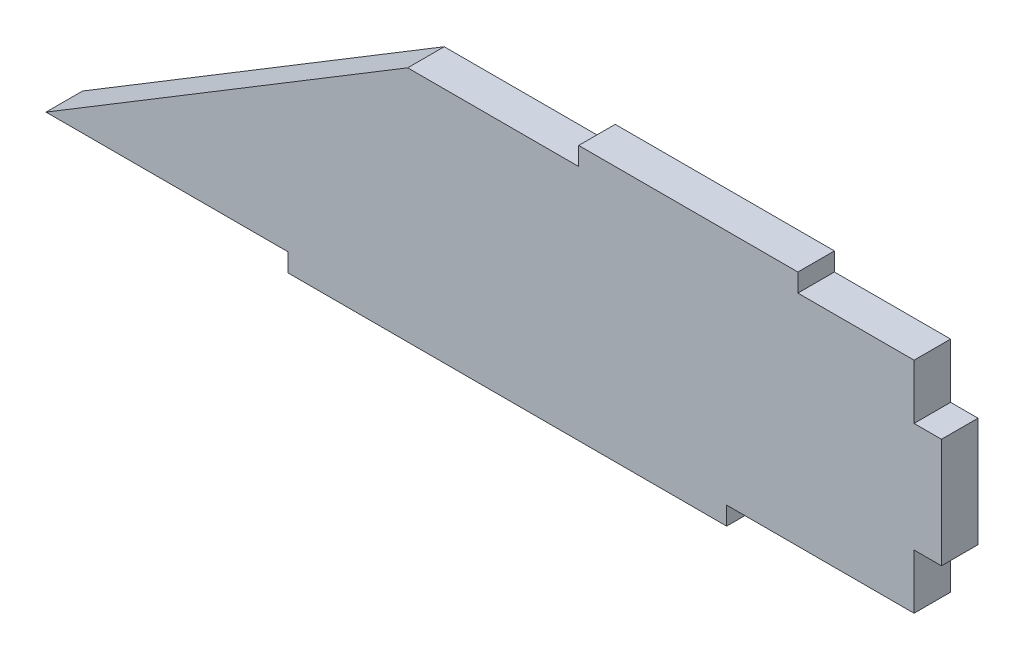
ISO-10303-21;
HEADER;
FILE_DESCRIPTION(('STEP AP214'),'2;1');
FILE_NAME('part.step','',(''),(''),'','','');
FILE_SCHEMA(('AUTOMOTIVE_DESIGN { 1 0 10303 214 1 1 1 1 }'));
ENDSEC;
DATA;
#1=APPLICATION_CONTEXT('core data for automotive mechanical design processes');
#2=APPLICATION_PROTOCOL_DEFINITION('international standard','automotive_design',2000,#1);
#3=PRODUCT_CONTEXT('',#1,'mechanical');
#4=PRODUCT('Part','Part','',(#3));
#5=PRODUCT_RELATED_PRODUCT_CATEGORY('part','',(#4));
#6=PRODUCT_DEFINITION_FORMATION('','',#4);
#7=PRODUCT_DEFINITION_CONTEXT('part definition',#1,'design');
#8=PRODUCT_DEFINITION('design','',#6,#7);
#9=PRODUCT_DEFINITION_SHAPE('','',#8);
#10=(LENGTH_UNIT() NAMED_UNIT(*) SI_UNIT(.MILLI.,.METRE.));
#11=(NAMED_UNIT(*) PLANE_ANGLE_UNIT() SI_UNIT($,.RADIAN.));
#12=(NAMED_UNIT(*) SI_UNIT($,.STERADIAN.) SOLID_ANGLE_UNIT());
#13=UNCERTAINTY_MEASURE_WITH_UNIT(LENGTH_MEASURE(1.E-05),#10,'distance_accuracy_value','');
#14=(GEOMETRIC_REPRESENTATION_CONTEXT(3) GLOBAL_UNCERTAINTY_ASSIGNED_CONTEXT((#13)) GLOBAL_UNIT_ASSIGNED_CONTEXT((#10,
#11,#12)) REPRESENTATION_CONTEXT('',''));
#15=CARTESIAN_POINT('',(0.,0.,0.));
#16=DIRECTION('',(0.,0.,1.));
#17=DIRECTION('',(1.,0.,0.));
#18=AXIS2_PLACEMENT_3D('',#15,#16,#17);
#19=CARTESIAN_POINT('',(-37.1415887647553,35.0708109179911,12.7));
#20=DIRECTION('',(0.518301716093344,-0.855197831554018,0.));
#21=DIRECTION('',(0.855197831554018,0.518301716093345,0.));
#22=AXIS2_PLACEMENT_3D('',#19,#20,#21);
#23=PLANE('',#22);
#24=DIRECTION('',(-0.855197831554018,-0.518301716093345,0.));
#25=VECTOR('',#24,1.);
#26=CARTESIAN_POINT('',(-37.1415887647553,35.0708109179911,0.));
#27=LINE('',#26,#25);
#28=CARTESIAN_POINT('',(-37.1415887647553,35.0708109179911,0.));
#29=VERTEX_POINT('',#28);
#30=CARTESIAN_POINT('',(-162.871588764755,-41.129189082009,0.));
#31=VERTEX_POINT('',#30);
#32=EDGE_CURVE('E175',#29,#31,#27,.T.);
#33=ORIENTED_EDGE('',*,*,#32,.T.);
#34=DIRECTION('',(0.,0.,-1.));
#35=VECTOR('',#34,1.);
#36=CARTESIAN_POINT('',(-162.871588764755,-41.129189082009,12.7));
#37=LINE('',#36,#35);
#38=CARTESIAN_POINT('',(-162.871588764755,-41.129189082009,12.7));
#39=VERTEX_POINT('',#38);
#40=EDGE_CURVE('E11',#39,#31,#37,.T.);
#41=ORIENTED_EDGE('',*,*,#40,.F.);
#42=DIRECTION('',(-0.855197831554018,-0.518301716093345,0.));
#43=VECTOR('',#42,1.);
#44=CARTESIAN_POINT('',(-37.1415887647553,35.0708109179911,12.7));
#45=LINE('',#44,#43);
#46=CARTESIAN_POINT('',(-37.1415887647553,35.0708109179911,12.7));
#47=VERTEX_POINT('',#46);
#48=EDGE_CURVE('E212',#47,#39,#45,.T.);
#49=ORIENTED_EDGE('',*,*,#48,.F.);
#50=DIRECTION('',(0.,0.,-1.));
#51=VECTOR('',#50,1.);
#52=CARTESIAN_POINT('',(-37.1415887647553,35.0708109179911,12.7));
#53=LINE('',#52,#51);
#54=EDGE_CURVE('E171',#47,#29,#53,.T.);
#55=ORIENTED_EDGE('',*,*,#54,.T.);
#56=EDGE_LOOP('',(#33,#41,#49,#55));
#57=FACE_BOUND('',#56,.T.);
#58=ADVANCED_FACE('F33',(#57),#23,.F.);
#59=CARTESIAN_POINT('',(-162.871588764755,-41.129189082009,12.7));
#60=DIRECTION('',(0.,1.,0.));
#61=DIRECTION('',(-1.,0.,0.));
#62=AXIS2_PLACEMENT_3D('',#59,#60,#61);
#63=PLANE('',#62);
#64=DIRECTION('',(1.,0.,0.));
#65=VECTOR('',#64,1.);
#66=CARTESIAN_POINT('',(-162.871588764755,-41.129189082009,0.));
#67=LINE('',#66,#65);
#68=CARTESIAN_POINT('',(-78.6705887647553,-41.1291890820089,0.));
#69=VERTEX_POINT('',#68);
#70=EDGE_CURVE('E178',#31,#69,#67,.T.);
#71=ORIENTED_EDGE('',*,*,#70,.T.);
#72=DIRECTION('',(0.,0.,-1.));
#73=VECTOR('',#72,1.);
#74=CARTESIAN_POINT('',(-78.6705887647553,-41.1291890820089,12.7));
#75=LINE('',#74,#73);
#76=CARTESIAN_POINT('',(-78.6705887647553,-41.1291890820089,12.7));
#77=VERTEX_POINT('',#76);
#78=EDGE_CURVE('E41',#77,#69,#75,.T.);
#79=ORIENTED_EDGE('',*,*,#78,.F.);
#80=DIRECTION('',(1.,0.,0.));
#81=VECTOR('',#80,1.);
#82=CARTESIAN_POINT('',(-162.871588764755,-41.129189082009,12.7));
#83=LINE('',#82,#81);
#84=EDGE_CURVE('E112',#39,#77,#83,.T.);
#85=ORIENTED_EDGE('',*,*,#84,.F.);
#86=ORIENTED_EDGE('',*,*,#40,.T.);
#87=EDGE_LOOP('',(#71,#79,#85,#86));
#88=FACE_BOUND('',#87,.T.);
#89=ADVANCED_FACE('F303',(#88),#63,.F.);
#90=CARTESIAN_POINT('',(-78.6705887647553,-41.1291890820089,12.7));
#91=DIRECTION('',(1.,0.,0.));
#92=DIRECTION('',(0.,0.,-1.));
#93=AXIS2_PLACEMENT_3D('',#90,#91,#92);
#94=PLANE('',#93);
#95=DIRECTION('',(0.,-1.,0.));
#96=VECTOR('',#95,1.);
#97=CARTESIAN_POINT('',(-78.6705887647553,-41.1291890820089,0.));
#98=LINE('',#97,#96);
#99=CARTESIAN_POINT('',(-78.6705887647553,-47.4791890820089,0.));
#100=VERTEX_POINT('',#99);
#101=EDGE_CURVE('E180',#69,#100,#98,.T.);
#102=ORIENTED_EDGE('',*,*,#101,.T.);
#103=DIRECTION('',(0.,0.,-1.));
#104=VECTOR('',#103,1.);
#105=CARTESIAN_POINT('',(-78.6705887647553,-47.4791890820089,12.7));
#106=LINE('',#105,#104);
#107=CARTESIAN_POINT('',(-78.6705887647553,-47.4791890820089,12.7));
#108=VERTEX_POINT('',#107);
#109=EDGE_CURVE('E238',#108,#100,#106,.T.);
#110=ORIENTED_EDGE('',*,*,#109,.F.);
#111=DIRECTION('',(0.,-1.,0.));
#112=VECTOR('',#111,1.);
#113=CARTESIAN_POINT('',(-78.6705887647553,-41.1291890820089,12.7));
#114=LINE('',#113,#112);
#115=EDGE_CURVE('E246',#77,#108,#114,.T.);
#116=ORIENTED_EDGE('',*,*,#115,.F.);
#117=ORIENTED_EDGE('',*,*,#78,.T.);
#118=EDGE_LOOP('',(#102,#110,#116,#117));
#119=FACE_BOUND('',#118,.T.);
#120=ADVANCED_FACE('F244',(#119),#94,.F.);
#121=CARTESIAN_POINT('',(-78.6705887647553,-47.4791890820089,12.7));
#122=DIRECTION('',(0.,1.,0.));
#123=DIRECTION('',(-1.,0.,0.));
#124=AXIS2_PLACEMENT_3D('',#121,#122,#123);
#125=PLANE('',#124);
#126=DIRECTION('',(1.,0.,0.));
#127=VECTOR('',#126,1.);
#128=CARTESIAN_POINT('',(-78.6705887647553,-47.4791890820089,0.));
#129=LINE('',#128,#127);
#130=CARTESIAN_POINT('',(73.7294112352447,-47.4791890820089,0.));
#131=VERTEX_POINT('',#130);
#132=EDGE_CURVE('E182',#100,#131,#129,.T.);
#133=ORIENTED_EDGE('',*,*,#132,.T.);
#134=DIRECTION('',(0.,0.,-1.));
#135=VECTOR('',#134,1.);
#136=CARTESIAN_POINT('',(73.7294112352447,-47.4791890820089,12.7));
#137=LINE('',#136,#135);
#138=CARTESIAN_POINT('',(73.7294112352447,-47.4791890820089,12.7));
#139=VERTEX_POINT('',#138);
#140=EDGE_CURVE('E235',#139,#131,#137,.T.);
#141=ORIENTED_EDGE('',*,*,#140,.F.);
#142=DIRECTION('',(1.,0.,0.));
#143=VECTOR('',#142,1.);
#144=CARTESIAN_POINT('',(-78.6705887647553,-47.4791890820089,12.7));
#145=LINE('',#144,#143);
#146=EDGE_CURVE('E264',#108,#139,#145,.T.);
#147=ORIENTED_EDGE('',*,*,#146,.F.);
#148=ORIENTED_EDGE('',*,*,#109,.T.);
#149=EDGE_LOOP('',(#133,#141,#147,#148));
#150=FACE_BOUND('',#149,.T.);
#151=ADVANCED_FACE('F255',(#150),#125,.F.);
#152=CARTESIAN_POINT('',(73.7294112352447,-47.4791890820089,12.7));
#153=DIRECTION('',(-1.,0.,0.));
#154=DIRECTION('',(0.,-1.,0.));
#155=AXIS2_PLACEMENT_3D('',#152,#153,#154);
#156=PLANE('',#155);
#157=DIRECTION('',(0.,1.,0.));
#158=VECTOR('',#157,1.);
#159=CARTESIAN_POINT('',(73.7294112352447,-47.4791890820089,0.));
#160=LINE('',#159,#158);
#161=CARTESIAN_POINT('',(73.7294112352447,-41.1291890820089,0.));
#162=VERTEX_POINT('',#161);
#163=EDGE_CURVE('E184',#131,#162,#160,.T.);
#164=ORIENTED_EDGE('',*,*,#163,.T.);
#165=DIRECTION('',(0.,0.,-1.));
#166=VECTOR('',#165,1.);
#167=CARTESIAN_POINT('',(73.7294112352447,-41.1291890820089,12.7));
#168=LINE('',#167,#166);
#169=CARTESIAN_POINT('',(73.7294112352447,-41.1291890820089,12.7));
#170=VERTEX_POINT('',#169);
#171=EDGE_CURVE('E232',#170,#162,#168,.T.);
#172=ORIENTED_EDGE('',*,*,#171,.F.);
#173=DIRECTION('',(0.,1.,0.));
#174=VECTOR('',#173,1.);
#175=CARTESIAN_POINT('',(73.7294112352447,-47.4791890820089,12.7));
#176=LINE('',#175,#174);
#177=EDGE_CURVE('E261',#139,#170,#176,.T.);
#178=ORIENTED_EDGE('',*,*,#177,.F.);
#179=ORIENTED_EDGE('',*,*,#140,.T.);
#180=EDGE_LOOP('',(#164,#172,#178,#179));
#181=FACE_BOUND('',#180,.T.);
#182=ADVANCED_FACE('F259',(#181),#156,.F.);
#183=CARTESIAN_POINT('',(73.7294112352447,-41.1291890820089,12.7));
#184=DIRECTION('',(0.,1.,0.));
#185=DIRECTION('',(-1.,0.,0.));
#186=AXIS2_PLACEMENT_3D('',#183,#184,#185);
#187=PLANE('',#186);
#188=DIRECTION('',(1.,0.,0.));
#189=VECTOR('',#188,1.);
#190=CARTESIAN_POINT('',(73.7294112352447,-41.1291890820089,0.));
#191=LINE('',#190,#189);
#192=CARTESIAN_POINT('',(138.880411235245,-41.1291890820089,0.));
#193=VERTEX_POINT('',#192);
#194=EDGE_CURVE('E186',#162,#193,#191,.T.);
#195=ORIENTED_EDGE('',*,*,#194,.T.);
#196=DIRECTION('',(0.,0.,-1.));
#197=VECTOR('',#196,1.);
#198=CARTESIAN_POINT('',(138.880411235245,-41.1291890820089,12.7));
#199=LINE('',#198,#197);
#200=CARTESIAN_POINT('',(138.880411235245,-41.1291890820089,12.7));
#201=VERTEX_POINT('',#200);
#202=EDGE_CURVE('E229',#201,#193,#199,.T.);
#203=ORIENTED_EDGE('',*,*,#202,.F.);
#204=DIRECTION('',(1.,0.,0.));
#205=VECTOR('',#204,1.);
#206=CARTESIAN_POINT('',(73.7294112352447,-41.1291890820089,12.7));
#207=LINE('',#206,#205);
#208=EDGE_CURVE('E263',#170,#201,#207,.T.);
#209=ORIENTED_EDGE('',*,*,#208,.F.);
#210=ORIENTED_EDGE('',*,*,#171,.T.);
#211=EDGE_LOOP('',(#195,#203,#209,#210));
#212=FACE_BOUND('',#211,.T.);
#213=ADVANCED_FACE('F316',(#212),#187,.F.);
#214=CARTESIAN_POINT('',(138.880411235245,-41.1291890820089,12.7));
#215=DIRECTION('',(-1.,0.,0.));
#216=DIRECTION('',(0.,0.,1.));
#217=AXIS2_PLACEMENT_3D('',#214,#215,#216);
#218=PLANE('',#217);
#219=DIRECTION('',(0.,1.,0.));
#220=VECTOR('',#219,1.);
#221=CARTESIAN_POINT('',(138.880411235245,-41.1291890820089,0.));
#222=LINE('',#221,#220);
#223=CARTESIAN_POINT('',(138.880411235245,-22.0791890820089,0.));
#224=VERTEX_POINT('',#223);
#225=EDGE_CURVE('E188',#193,#224,#222,.T.);
#226=ORIENTED_EDGE('',*,*,#225,.T.);
#227=DIRECTION('',(0.,0.,-1.));
#228=VECTOR('',#227,1.);
#229=CARTESIAN_POINT('',(138.880411235245,-22.0791890820089,12.7));
#230=LINE('',#229,#228);
#231=CARTESIAN_POINT('',(138.880411235245,-22.0791890820089,12.7));
#232=VERTEX_POINT('',#231);
#233=EDGE_CURVE('E227',#232,#224,#230,.T.);
#234=ORIENTED_EDGE('',*,*,#233,.F.);
#235=DIRECTION('',(0.,1.,0.));
#236=VECTOR('',#235,1.);
#237=CARTESIAN_POINT('',(138.880411235245,-41.1291890820089,12.7));
#238=LINE('',#237,#236);
#239=EDGE_CURVE('E266',#201,#232,#238,.T.);
#240=ORIENTED_EDGE('',*,*,#239,.F.);
#241=ORIENTED_EDGE('',*,*,#202,.T.);
#242=EDGE_LOOP('',(#226,#234,#240,#241));
#243=FACE_BOUND('',#242,.T.);
#244=ADVANCED_FACE('F319',(#243),#218,.F.);
#245=CARTESIAN_POINT('',(148.405411235245,-22.0791890820089,12.7));
#246=DIRECTION('',(0.,-1.,0.));
#247=DIRECTION('',(1.,0.,0.));
#248=AXIS2_PLACEMENT_3D('',#245,#246,#247);
#249=PLANE('',#248);
#250=DIRECTION('',(-1.,0.,0.));
#251=VECTOR('',#250,1.);
#252=CARTESIAN_POINT('',(148.405411235245,-22.0791890820089,0.));
#253=LINE('',#252,#251);
#254=CARTESIAN_POINT('',(148.405411235245,-22.0791890820089,0.));
#255=VERTEX_POINT('',#254);
#256=EDGE_CURVE('E191',#255,#224,#253,.T.);
#257=ORIENTED_EDGE('',*,*,#256,.F.);
#258=DIRECTION('',(0.,0.,-1.));
#259=VECTOR('',#258,1.);
#260=CARTESIAN_POINT('',(148.405411235245,-22.0791890820089,12.7));
#261=LINE('',#260,#259);
#262=CARTESIAN_POINT('',(148.405411235245,-22.0791890820089,12.7));
#263=VERTEX_POINT('',#262);
#264=EDGE_CURVE('E225',#263,#255,#261,.T.);
#265=ORIENTED_EDGE('',*,*,#264,.F.);
#266=DIRECTION('',(-1.,0.,0.));
#267=VECTOR('',#266,1.);
#268=CARTESIAN_POINT('',(148.405411235245,-22.0791890820089,12.7));
#269=LINE('',#268,#267);
#270=EDGE_CURVE('E272',#263,#232,#269,.T.);
#271=ORIENTED_EDGE('',*,*,#270,.T.);
#272=ORIENTED_EDGE('',*,*,#233,.T.);
#273=EDGE_LOOP('',(#257,#265,#271,#272));
#274=FACE_BOUND('',#273,.T.);
#275=ADVANCED_FACE('F323',(#274),#249,.T.);
#276=CARTESIAN_POINT('',(148.405411235245,16.0208109179911,12.7));
#277=DIRECTION('',(1.,0.,0.));
#278=DIRECTION('',(0.,0.,-1.));
#279=AXIS2_PLACEMENT_3D('',#276,#277,#278);
#280=PLANE('',#279);
#281=DIRECTION('',(0.,-1.,0.));
#282=VECTOR('',#281,1.);
#283=CARTESIAN_POINT('',(148.405411235245,16.0208109179911,0.));
#284=LINE('',#283,#282);
#285=CARTESIAN_POINT('',(148.405411235245,16.0208109179911,0.));
#286=VERTEX_POINT('',#285);
#287=EDGE_CURVE('E194',#286,#255,#284,.T.);
#288=ORIENTED_EDGE('',*,*,#287,.F.);
#289=DIRECTION('',(0.,0.,-1.));
#290=VECTOR('',#289,1.);
#291=CARTESIAN_POINT('',(148.405411235245,16.0208109179911,12.7));
#292=LINE('',#291,#290);
#293=CARTESIAN_POINT('',(148.405411235245,16.0208109179911,12.7));
#294=VERTEX_POINT('',#293);
#295=EDGE_CURVE('E223',#294,#286,#292,.T.);
#296=ORIENTED_EDGE('',*,*,#295,.F.);
#297=DIRECTION('',(0.,-1.,0.));
#298=VECTOR('',#297,1.);
#299=CARTESIAN_POINT('',(148.405411235245,16.0208109179911,12.7));
#300=LINE('',#299,#298);
#301=EDGE_CURVE('E275',#294,#263,#300,.T.);
#302=ORIENTED_EDGE('',*,*,#301,.T.);
#303=ORIENTED_EDGE('',*,*,#264,.T.);
#304=EDGE_LOOP('',(#288,#296,#302,#303));
#305=FACE_BOUND('',#304,.T.);
#306=ADVANCED_FACE('F327',(#305),#280,.T.);
#307=CARTESIAN_POINT('',(138.880411235245,16.0208109179911,12.7));
#308=DIRECTION('',(0.,1.,0.));
#309=DIRECTION('',(0.,0.,1.));
#310=AXIS2_PLACEMENT_3D('',#307,#308,#309);
#311=PLANE('',#310);
#312=DIRECTION('',(1.,0.,0.));
#313=VECTOR('',#312,1.);
#314=CARTESIAN_POINT('',(138.880411235245,16.0208109179911,0.));
#315=LINE('',#314,#313);
#316=CARTESIAN_POINT('',(138.880411235245,16.0208109179911,0.));
#317=VERTEX_POINT('',#316);
#318=EDGE_CURVE('E197',#317,#286,#315,.T.);
#319=ORIENTED_EDGE('',*,*,#318,.F.);
#320=DIRECTION('',(0.,0.,-1.));
#321=VECTOR('',#320,1.);
#322=CARTESIAN_POINT('',(138.880411235245,16.0208109179911,12.7));
#323=LINE('',#322,#321);
#324=CARTESIAN_POINT('',(138.880411235245,16.0208109179911,12.7));
#325=VERTEX_POINT('',#324);
#326=EDGE_CURVE('E221',#325,#317,#323,.T.);
#327=ORIENTED_EDGE('',*,*,#326,.F.);
#328=DIRECTION('',(1.,0.,0.));
#329=VECTOR('',#328,1.);
#330=CARTESIAN_POINT('',(138.880411235245,16.0208109179911,12.7));
#331=LINE('',#330,#329);
#332=EDGE_CURVE('E278',#325,#294,#331,.T.);
#333=ORIENTED_EDGE('',*,*,#332,.T.);
#334=ORIENTED_EDGE('',*,*,#295,.T.);
#335=EDGE_LOOP('',(#319,#327,#333,#334));
#336=FACE_BOUND('',#335,.T.);
#337=ADVANCED_FACE('F331',(#336),#311,.T.);
#338=CARTESIAN_POINT('',(138.880411235245,16.0208109179911,12.7));
#339=DIRECTION('',(-1.,0.,0.));
#340=DIRECTION('',(0.,-1.,0.));
#341=AXIS2_PLACEMENT_3D('',#338,#339,#340);
#342=PLANE('',#341);
#343=DIRECTION('',(0.,1.,0.));
#344=VECTOR('',#343,1.);
#345=CARTESIAN_POINT('',(138.880411235245,16.0208109179911,0.));
#346=LINE('',#345,#344);
#347=CARTESIAN_POINT('',(138.880411235245,35.0708109179911,0.));
#348=VERTEX_POINT('',#347);
#349=EDGE_CURVE('E200',#317,#348,#346,.T.);
#350=ORIENTED_EDGE('',*,*,#349,.T.);
#351=DIRECTION('',(0.,0.,-1.));
#352=VECTOR('',#351,1.);
#353=CARTESIAN_POINT('',(138.880411235245,35.0708109179911,12.7));
#354=LINE('',#353,#352);
#355=CARTESIAN_POINT('',(138.880411235245,35.0708109179911,12.7));
#356=VERTEX_POINT('',#355);
#357=EDGE_CURVE('E218',#356,#348,#354,.T.);
#358=ORIENTED_EDGE('',*,*,#357,.F.);
#359=DIRECTION('',(0.,1.,0.));
#360=VECTOR('',#359,1.);
#361=CARTESIAN_POINT('',(138.880411235245,16.0208109179911,12.7));
#362=LINE('',#361,#360);
#363=EDGE_CURVE('E281',#325,#356,#362,.T.);
#364=ORIENTED_EDGE('',*,*,#363,.F.);
#365=ORIENTED_EDGE('',*,*,#326,.T.);
#366=EDGE_LOOP('',(#350,#358,#364,#365));
#367=FACE_BOUND('',#366,.T.);
#368=ADVANCED_FACE('F335',(#367),#342,.F.);
#369=CARTESIAN_POINT('',(138.880411235245,35.0708109179911,12.7));
#370=DIRECTION('',(0.,-1.,0.));
#371=DIRECTION('',(1.,0.,0.));
#372=AXIS2_PLACEMENT_3D('',#369,#370,#371);
#373=PLANE('',#372);
#374=DIRECTION('',(-1.,0.,0.));
#375=VECTOR('',#374,1.);
#376=CARTESIAN_POINT('',(138.880411235245,35.0708109179911,0.));
#377=LINE('',#376,#375);
#378=CARTESIAN_POINT('',(98.4944112352447,35.0708109179911,0.));
#379=VERTEX_POINT('',#378);
#380=EDGE_CURVE('E202',#348,#379,#377,.T.);
#381=ORIENTED_EDGE('',*,*,#380,.T.);
#382=DIRECTION('',(0.,0.,-1.));
#383=VECTOR('',#382,1.);
#384=CARTESIAN_POINT('',(98.4944112352447,35.0708109179911,12.7));
#385=LINE('',#384,#383);
#386=CARTESIAN_POINT('',(98.4944112352447,35.0708109179911,12.7));
#387=VERTEX_POINT('',#386);
#388=EDGE_CURVE('E216',#387,#379,#385,.T.);
#389=ORIENTED_EDGE('',*,*,#388,.F.);
#390=DIRECTION('',(-1.,0.,0.));
#391=VECTOR('',#390,1.);
#392=CARTESIAN_POINT('',(138.880411235245,35.0708109179911,12.7));
#393=LINE('',#392,#391);
#394=EDGE_CURVE('E283',#356,#387,#393,.T.);
#395=ORIENTED_EDGE('',*,*,#394,.F.);
#396=ORIENTED_EDGE('',*,*,#357,.T.);
#397=EDGE_LOOP('',(#381,#389,#395,#396));
#398=FACE_BOUND('',#397,.T.);
#399=ADVANCED_FACE('F339',(#398),#373,.F.);
#400=CARTESIAN_POINT('',(98.4944112352447,41.4208109179911,12.7));
#401=DIRECTION('',(1.,0.,0.));
#402=DIRECTION('',(0.,0.,-1.));
#403=AXIS2_PLACEMENT_3D('',#400,#401,#402);
#404=PLANE('',#403);
#405=DIRECTION('',(0.,-1.,0.));
#406=VECTOR('',#405,1.);
#407=CARTESIAN_POINT('',(98.4944112352447,41.4208109179911,0.));
#408=LINE('',#407,#406);
#409=CARTESIAN_POINT('',(98.4944112352447,41.4208109179911,0.));
#410=VERTEX_POINT('',#409);
#411=EDGE_CURVE('E205',#410,#379,#408,.T.);
#412=ORIENTED_EDGE('',*,*,#411,.F.);
#413=DIRECTION('',(0.,0.,-1.));
#414=VECTOR('',#413,1.);
#415=CARTESIAN_POINT('',(98.4944112352447,41.4208109179911,12.7));
#416=LINE('',#415,#414);
#417=CARTESIAN_POINT('',(98.4944112352447,41.4208109179911,12.7));
#418=VERTEX_POINT('',#417);
#419=EDGE_CURVE('E161',#418,#410,#416,.T.);
#420=ORIENTED_EDGE('',*,*,#419,.F.);
#421=DIRECTION('',(0.,-1.,0.));
#422=VECTOR('',#421,1.);
#423=CARTESIAN_POINT('',(98.4944112352447,41.4208109179911,12.7));
#424=LINE('',#423,#422);
#425=EDGE_CURVE('E167',#418,#387,#424,.T.);
#426=ORIENTED_EDGE('',*,*,#425,.T.);
#427=ORIENTED_EDGE('',*,*,#388,.T.);
#428=EDGE_LOOP('',(#412,#420,#426,#427));
#429=FACE_BOUND('',#428,.T.);
#430=ADVANCED_FACE('F286',(#429),#404,.T.);
#431=CARTESIAN_POINT('',(22.2944112352447,41.4208109179911,12.7));
#432=DIRECTION('',(0.,1.,0.));
#433=DIRECTION('',(0.,0.,1.));
#434=AXIS2_PLACEMENT_3D('',#431,#432,#433);
#435=PLANE('',#434);
#436=DIRECTION('',(1.,0.,0.));
#437=VECTOR('',#436,1.);
#438=CARTESIAN_POINT('',(22.2944112352447,41.4208109179911,0.));
#439=LINE('',#438,#437);
#440=CARTESIAN_POINT('',(22.2944112352447,41.4208109179911,0.));
#441=VERTEX_POINT('',#440);
#442=EDGE_CURVE('E156',#441,#410,#439,.T.);
#443=ORIENTED_EDGE('',*,*,#442,.F.);
#444=DIRECTION('',(0.,0.,-1.));
#445=VECTOR('',#444,1.);
#446=CARTESIAN_POINT('',(22.2944112352447,41.4208109179911,12.7));
#447=LINE('',#446,#445);
#448=CARTESIAN_POINT('',(22.2944112352447,41.4208109179911,12.7));
#449=VERTEX_POINT('',#448);
#450=EDGE_CURVE('E151',#449,#441,#447,.T.);
#451=ORIENTED_EDGE('',*,*,#450,.F.);
#452=DIRECTION('',(1.,0.,0.));
#453=VECTOR('',#452,1.);
#454=CARTESIAN_POINT('',(22.2944112352447,41.4208109179911,12.7));
#455=LINE('',#454,#453);
#456=EDGE_CURVE('E154',#449,#418,#455,.T.);
#457=ORIENTED_EDGE('',*,*,#456,.T.);
#458=ORIENTED_EDGE('',*,*,#419,.T.);
#459=EDGE_LOOP('',(#443,#451,#457,#458));
#460=FACE_BOUND('',#459,.T.);
#461=ADVANCED_FACE('F153',(#460),#435,.T.);
#462=CARTESIAN_POINT('',(22.2944112352447,35.0708109179911,12.7));
#463=DIRECTION('',(-1.,0.,0.));
#464=DIRECTION('',(0.,0.,1.));
#465=AXIS2_PLACEMENT_3D('',#462,#463,#464);
#466=PLANE('',#465);
#467=DIRECTION('',(0.,1.,0.));
#468=VECTOR('',#467,1.);
#469=CARTESIAN_POINT('',(22.2944112352447,35.0708109179911,0.));
#470=LINE('',#469,#468);
#471=CARTESIAN_POINT('',(22.2944112352447,35.0708109179911,0.));
#472=VERTEX_POINT('',#471);
#473=EDGE_CURVE('E209',#472,#441,#470,.T.);
#474=ORIENTED_EDGE('',*,*,#473,.F.);
#475=DIRECTION('',(0.,0.,-1.));
#476=VECTOR('',#475,1.);
#477=CARTESIAN_POINT('',(22.2944112352447,35.0708109179911,12.7));
#478=LINE('',#477,#476);
#479=CARTESIAN_POINT('',(22.2944112352447,35.0708109179911,12.7));
#480=VERTEX_POINT('',#479);
#481=EDGE_CURVE('E101',#480,#472,#478,.T.);
#482=ORIENTED_EDGE('',*,*,#481,.F.);
#483=DIRECTION('',(0.,1.,0.));
#484=VECTOR('',#483,1.);
#485=CARTESIAN_POINT('',(22.2944112352447,35.0708109179911,12.7));
#486=LINE('',#485,#484);
#487=EDGE_CURVE('E165',#480,#449,#486,.T.);
#488=ORIENTED_EDGE('',*,*,#487,.T.);
#489=ORIENTED_EDGE('',*,*,#450,.T.);
#490=EDGE_LOOP('',(#474,#482,#488,#489));
#491=FACE_BOUND('',#490,.T.);
#492=ADVANCED_FACE('F169',(#491),#466,.T.);
#493=CARTESIAN_POINT('',(22.2944112352447,35.0708109179911,12.7));
#494=DIRECTION('',(0.,-1.,0.));
#495=DIRECTION('',(1.,0.,0.));
#496=AXIS2_PLACEMENT_3D('',#493,#494,#495);
#497=PLANE('',#496);
#498=DIRECTION('',(-1.,0.,0.));
#499=VECTOR('',#498,1.);
#500=CARTESIAN_POINT('',(22.2944112352447,35.0708109179911,0.));
#501=LINE('',#500,#499);
#502=EDGE_CURVE('E104',#472,#29,#501,.T.);
#503=ORIENTED_EDGE('',*,*,#502,.T.);
#504=ORIENTED_EDGE('',*,*,#54,.F.);
#505=DIRECTION('',(-1.,0.,0.));
#506=VECTOR('',#505,1.);
#507=CARTESIAN_POINT('',(22.2944112352447,35.0708109179911,12.7));
#508=LINE('',#507,#506);
#509=EDGE_CURVE('E49',#480,#47,#508,.T.);
#510=ORIENTED_EDGE('',*,*,#509,.F.);
#511=ORIENTED_EDGE('',*,*,#481,.T.);
#512=EDGE_LOOP('',(#503,#504,#510,#511));
#513=FACE_BOUND('',#512,.T.);
#514=ADVANCED_FACE('F292',(#513),#497,.F.);
#515=CARTESIAN_POINT('',(0.,0.,12.7));
#516=DIRECTION('',(0.,0.,1.));
#517=DIRECTION('',(1.,0.,0.));
#518=AXIS2_PLACEMENT_3D('',#515,#516,#517);
#519=PLANE('',#518);
#520=ORIENTED_EDGE('',*,*,#48,.T.);
#521=ORIENTED_EDGE('',*,*,#84,.T.);
#522=ORIENTED_EDGE('',*,*,#115,.T.);
#523=ORIENTED_EDGE('',*,*,#146,.T.);
#524=ORIENTED_EDGE('',*,*,#177,.T.);
#525=ORIENTED_EDGE('',*,*,#208,.T.);
#526=ORIENTED_EDGE('',*,*,#239,.T.);
#527=ORIENTED_EDGE('',*,*,#270,.F.);
#528=ORIENTED_EDGE('',*,*,#301,.F.);
#529=ORIENTED_EDGE('',*,*,#332,.F.);
#530=ORIENTED_EDGE('',*,*,#363,.T.);
#531=ORIENTED_EDGE('',*,*,#394,.T.);
#532=ORIENTED_EDGE('',*,*,#425,.F.);
#533=ORIENTED_EDGE('',*,*,#456,.F.);
#534=ORIENTED_EDGE('',*,*,#487,.F.);
#535=ORIENTED_EDGE('',*,*,#509,.T.);
#536=EDGE_LOOP('',(#520,#521,#522,#523,#524,#525,#526,#527,#528,#529,#530,#531,#532,#533,#534,#535));
#537=FACE_BOUND('',#536,.T.);
#538=ADVANCED_FACE('F164',(#537),#519,.T.);
#539=CARTESIAN_POINT('',(0.,0.,0.));
#540=DIRECTION('',(0.,0.,1.));
#541=DIRECTION('',(1.,0.,0.));
#542=AXIS2_PLACEMENT_3D('',#539,#540,#541);
#543=PLANE('',#542);
#544=ORIENTED_EDGE('',*,*,#32,.F.);
#545=ORIENTED_EDGE('',*,*,#502,.F.);
#546=ORIENTED_EDGE('',*,*,#473,.T.);
#547=ORIENTED_EDGE('',*,*,#442,.T.);
#548=ORIENTED_EDGE('',*,*,#411,.T.);
#549=ORIENTED_EDGE('',*,*,#380,.F.);
#550=ORIENTED_EDGE('',*,*,#349,.F.);
#551=ORIENTED_EDGE('',*,*,#318,.T.);
#552=ORIENTED_EDGE('',*,*,#287,.T.);
#553=ORIENTED_EDGE('',*,*,#256,.T.);
#554=ORIENTED_EDGE('',*,*,#225,.F.);
#555=ORIENTED_EDGE('',*,*,#194,.F.);
#556=ORIENTED_EDGE('',*,*,#163,.F.);
#557=ORIENTED_EDGE('',*,*,#132,.F.);
#558=ORIENTED_EDGE('',*,*,#101,.F.);
#559=ORIENTED_EDGE('',*,*,#70,.F.);
#560=EDGE_LOOP('',(#544,#545,#546,#547,#548,#549,#550,#551,#552,#553,#554,#555,#556,#557,#558,#559));
#561=FACE_BOUND('',#560,.T.);
#562=ADVANCED_FACE('F250',(#561),#543,.F.);
#563=CLOSED_SHELL('',(#58,#89,#120,#151,#182,#213,#244,#275,#306,#337,#368,#399,#430,#461,#492,
#514,#538,#562));
#564=MANIFOLD_SOLID_BREP('B2',#563);
#565=ADVANCED_BREP_SHAPE_REPRESENTATION('',(#18,#564),#14);
#566=SHAPE_DEFINITION_REPRESENTATION(#9,#565);
ENDSEC;
END-ISO-10303-21;
